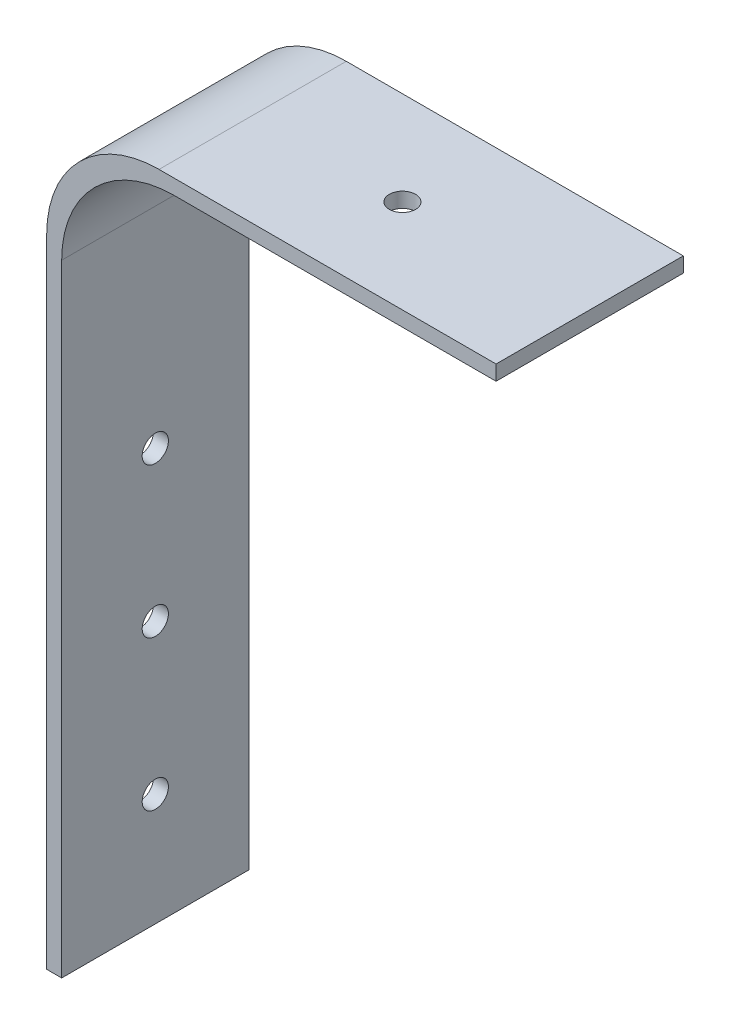
ISO-10303-21;
HEADER;
FILE_DESCRIPTION(('STEP AP214'),'2;1');
FILE_NAME('part.step','',(''),(''),'','','');
FILE_SCHEMA(('AUTOMOTIVE_DESIGN { 1 0 10303 214 1 1 1 1 }'));
ENDSEC;
DATA;
#1=APPLICATION_CONTEXT('core data for automotive mechanical design processes');
#2=APPLICATION_PROTOCOL_DEFINITION('international standard','automotive_design',2000,#1);
#3=PRODUCT_CONTEXT('',#1,'mechanical');
#4=PRODUCT('Part','Part','',(#3));
#5=PRODUCT_RELATED_PRODUCT_CATEGORY('part','',(#4));
#6=PRODUCT_DEFINITION_FORMATION('','',#4);
#7=PRODUCT_DEFINITION_CONTEXT('part definition',#1,'design');
#8=PRODUCT_DEFINITION('design','',#6,#7);
#9=PRODUCT_DEFINITION_SHAPE('','',#8);
#10=(LENGTH_UNIT() NAMED_UNIT(*) SI_UNIT(.MILLI.,.METRE.));
#11=(NAMED_UNIT(*) PLANE_ANGLE_UNIT() SI_UNIT($,.RADIAN.));
#12=(NAMED_UNIT(*) SI_UNIT($,.STERADIAN.) SOLID_ANGLE_UNIT());
#13=UNCERTAINTY_MEASURE_WITH_UNIT(LENGTH_MEASURE(1.E-05),#10,'distance_accuracy_value','');
#14=(GEOMETRIC_REPRESENTATION_CONTEXT(3) GLOBAL_UNCERTAINTY_ASSIGNED_CONTEXT((#13)) GLOBAL_UNIT_ASSIGNED_CONTEXT((#10,
#11,#12)) REPRESENTATION_CONTEXT('',''));
#15=CARTESIAN_POINT('',(0.,0.,0.));
#16=DIRECTION('',(0.,0.,1.));
#17=DIRECTION('',(1.,0.,0.));
#18=AXIS2_PLACEMENT_3D('',#15,#16,#17);
#19=CARTESIAN_POINT('',(30.,30.,25.));
#20=DIRECTION('',(-1.,0.,0.));
#21=DIRECTION('',(0.,-1.,0.));
#22=AXIS2_PLACEMENT_3D('',#19,#20,#21);
#23=PLANE('',#22);
#24=DIRECTION('',(0.,1.,0.));
#25=VECTOR('',#24,1.);
#26=CARTESIAN_POINT('',(30.,30.,0.));
#27=LINE('',#26,#25);
#28=CARTESIAN_POINT('',(30.,28.,0.));
#29=VERTEX_POINT('',#28);
#30=CARTESIAN_POINT('',(30.,30.,0.));
#31=VERTEX_POINT('',#30);
#32=EDGE_CURVE('E146',#29,#31,#27,.T.);
#33=ORIENTED_EDGE('',*,*,#32,.T.);
#34=DIRECTION('',(0.,0.,-1.));
#35=VECTOR('',#34,1.);
#36=CARTESIAN_POINT('',(30.,30.,25.));
#37=LINE('',#36,#35);
#38=CARTESIAN_POINT('',(30.,30.,25.));
#39=VERTEX_POINT('',#38);
#40=EDGE_CURVE('E11',#39,#31,#37,.T.);
#41=ORIENTED_EDGE('',*,*,#40,.F.);
#42=DIRECTION('',(0.,1.,0.));
#43=VECTOR('',#42,1.);
#44=CARTESIAN_POINT('',(30.,30.,25.));
#45=LINE('',#44,#43);
#46=CARTESIAN_POINT('',(30.,28.,25.));
#47=VERTEX_POINT('',#46);
#48=EDGE_CURVE('E169',#47,#39,#45,.T.);
#49=ORIENTED_EDGE('',*,*,#48,.F.);
#50=DIRECTION('',(0.,0.,-1.));
#51=VECTOR('',#50,1.);
#52=CARTESIAN_POINT('',(30.,28.,25.));
#53=LINE('',#52,#51);
#54=EDGE_CURVE('E142',#47,#29,#53,.T.);
#55=ORIENTED_EDGE('',*,*,#54,.T.);
#56=EDGE_LOOP('',(#33,#41,#49,#55));
#57=FACE_BOUND('',#56,.T.);
#58=ADVANCED_FACE('F45',(#57),#23,.F.);
#59=CARTESIAN_POINT('',(-15.,30.,25.));
#60=DIRECTION('',(0.,-1.,0.));
#61=DIRECTION('',(0.,0.,-1.));
#62=AXIS2_PLACEMENT_3D('',#59,#60,#61);
#63=PLANE('',#62);
#64=CARTESIAN_POINT('',(5.,30.,12.5));
#65=DIRECTION('',(0.,1.,0.));
#66=DIRECTION('',(0.,0.,1.));
#67=AXIS2_PLACEMENT_3D('',#64,#65,#66);
#68=CIRCLE('',#67,1.75);
#69=CARTESIAN_POINT('',(5.,30.,14.25));
#70=VERTEX_POINT('',#69);
#71=EDGE_CURVE('E237',#70,#70,#68,.T.);
#72=ORIENTED_EDGE('',*,*,#71,.F.);
#73=EDGE_LOOP('',(#72));
#74=FACE_BOUND('',#73,.T.);
#75=DIRECTION('',(-1.,0.,0.));
#76=VECTOR('',#75,1.);
#77=CARTESIAN_POINT('',(-15.,30.,0.));
#78=LINE('',#77,#76);
#79=CARTESIAN_POINT('',(-15.,30.,0.));
#80=VERTEX_POINT('',#79);
#81=EDGE_CURVE('E150',#31,#80,#78,.T.);
#82=ORIENTED_EDGE('',*,*,#81,.T.);
#83=DIRECTION('',(0.,0.,-1.));
#84=VECTOR('',#83,1.);
#85=CARTESIAN_POINT('',(-15.,30.,25.));
#86=LINE('',#85,#84);
#87=CARTESIAN_POINT('',(-15.,30.,25.));
#88=VERTEX_POINT('',#87);
#89=EDGE_CURVE('E54',#88,#80,#86,.T.);
#90=ORIENTED_EDGE('',*,*,#89,.F.);
#91=DIRECTION('',(-1.,0.,0.));
#92=VECTOR('',#91,1.);
#93=CARTESIAN_POINT('',(-15.,30.,25.));
#94=LINE('',#93,#92);
#95=EDGE_CURVE('E105',#39,#88,#94,.T.);
#96=ORIENTED_EDGE('',*,*,#95,.F.);
#97=ORIENTED_EDGE('',*,*,#40,.T.);
#98=EDGE_LOOP('',(#82,#90,#96,#97));
#99=FACE_BOUND('',#98,.T.);
#100=ADVANCED_FACE('F254',(#74,#99),#63,.F.);
#101=CARTESIAN_POINT('',(-15.,15.,25.));
#102=DIRECTION('',(0.,0.,-1.));
#103=DIRECTION('',(-1.,0.,0.));
#104=AXIS2_PLACEMENT_3D('',#101,#102,#103);
#105=CYLINDRICAL_SURFACE('',#104,15.);
#106=CARTESIAN_POINT('',(-15.,15.,0.));
#107=DIRECTION('',(0.,0.,1.));
#108=DIRECTION('',(1.,0.,0.));
#109=AXIS2_PLACEMENT_3D('',#106,#107,#108);
#110=CIRCLE('',#109,15.);
#111=CARTESIAN_POINT('',(-30.,15.,0.));
#112=VERTEX_POINT('',#111);
#113=EDGE_CURVE('E154',#80,#112,#110,.T.);
#114=ORIENTED_EDGE('',*,*,#113,.T.);
#115=DIRECTION('',(0.,0.,-1.));
#116=VECTOR('',#115,1.);
#117=CARTESIAN_POINT('',(-30.,15.,25.));
#118=LINE('',#117,#116);
#119=CARTESIAN_POINT('',(-30.,15.,25.));
#120=VERTEX_POINT('',#119);
#121=EDGE_CURVE('E180',#120,#112,#118,.T.);
#122=ORIENTED_EDGE('',*,*,#121,.F.);
#123=CARTESIAN_POINT('',(-15.,15.,25.));
#124=DIRECTION('',(0.,0.,1.));
#125=DIRECTION('',(1.,0.,0.));
#126=AXIS2_PLACEMENT_3D('',#123,#124,#125);
#127=CIRCLE('',#126,15.);
#128=EDGE_CURVE('E190',#88,#120,#127,.T.);
#129=ORIENTED_EDGE('',*,*,#128,.F.);
#130=ORIENTED_EDGE('',*,*,#89,.T.);
#131=EDGE_LOOP('',(#114,#122,#129,#130));
#132=FACE_BOUND('',#131,.T.);
#133=ADVANCED_FACE('F188',(#132),#105,.T.);
#134=CARTESIAN_POINT('',(-30.,15.,25.));
#135=DIRECTION('',(1.,0.,0.));
#136=DIRECTION('',(0.,1.,0.));
#137=AXIS2_PLACEMENT_3D('',#134,#135,#136);
#138=PLANE('',#137);
#139=CARTESIAN_POINT('',(-30.,-15.,12.5));
#140=DIRECTION('',(-1.,0.,0.));
#141=DIRECTION('',(0.,-1.,0.));
#142=AXIS2_PLACEMENT_3D('',#139,#140,#141);
#143=CIRCLE('',#142,1.75);
#144=CARTESIAN_POINT('',(-30.,-16.75,12.5));
#145=VERTEX_POINT('',#144);
#146=EDGE_CURVE('E230',#145,#145,#143,.T.);
#147=ORIENTED_EDGE('',*,*,#146,.F.);
#148=EDGE_LOOP('',(#147));
#149=FACE_BOUND('',#148,.T.);
#150=CARTESIAN_POINT('',(-30.,-35.,12.5000000000002));
#151=DIRECTION('',(-1.,0.,0.));
#152=DIRECTION('',(0.,-1.,0.));
#153=AXIS2_PLACEMENT_3D('',#150,#151,#152);
#154=CIRCLE('',#153,1.75);
#155=CARTESIAN_POINT('',(-30.,-36.75,12.5000000000002));
#156=VERTEX_POINT('',#155);
#157=EDGE_CURVE('E226',#156,#156,#154,.T.);
#158=ORIENTED_EDGE('',*,*,#157,.F.);
#159=EDGE_LOOP('',(#158));
#160=FACE_BOUND('',#159,.T.);
#161=CARTESIAN_POINT('',(-30.,-55.,12.5000000000004));
#162=DIRECTION('',(-1.,0.,0.));
#163=DIRECTION('',(0.,-1.,0.));
#164=AXIS2_PLACEMENT_3D('',#161,#162,#163);
#165=CIRCLE('',#164,1.75);
#166=CARTESIAN_POINT('',(-30.,-56.75,12.5000000000004));
#167=VERTEX_POINT('',#166);
#168=EDGE_CURVE('E217',#167,#167,#165,.T.);
#169=ORIENTED_EDGE('',*,*,#168,.F.);
#170=EDGE_LOOP('',(#169));
#171=FACE_BOUND('',#170,.T.);
#172=DIRECTION('',(0.,-1.,0.));
#173=VECTOR('',#172,1.);
#174=CARTESIAN_POINT('',(-30.,15.,0.));
#175=LINE('',#174,#173);
#176=CARTESIAN_POINT('',(-30.,-70.,0.));
#177=VERTEX_POINT('',#176);
#178=EDGE_CURVE('E157',#112,#177,#175,.T.);
#179=ORIENTED_EDGE('',*,*,#178,.T.);
#180=DIRECTION('',(0.,0.,-1.));
#181=VECTOR('',#180,1.);
#182=CARTESIAN_POINT('',(-30.,-70.,25.));
#183=LINE('',#182,#181);
#184=CARTESIAN_POINT('',(-30.,-70.,25.));
#185=VERTEX_POINT('',#184);
#186=EDGE_CURVE('E176',#185,#177,#183,.T.);
#187=ORIENTED_EDGE('',*,*,#186,.F.);
#188=DIRECTION('',(0.,-1.,0.));
#189=VECTOR('',#188,1.);
#190=CARTESIAN_POINT('',(-30.,15.,25.));
#191=LINE('',#190,#189);
#192=EDGE_CURVE('E203',#120,#185,#191,.T.);
#193=ORIENTED_EDGE('',*,*,#192,.F.);
#194=ORIENTED_EDGE('',*,*,#121,.T.);
#195=EDGE_LOOP('',(#179,#187,#193,#194));
#196=FACE_BOUND('',#195,.T.);
#197=ADVANCED_FACE('F198',(#149,#160,#171,#196),#138,.F.);
#198=CARTESIAN_POINT('',(-30.,-70.,25.));
#199=DIRECTION('',(0.,1.,0.));
#200=DIRECTION('',(0.,0.,1.));
#201=AXIS2_PLACEMENT_3D('',#198,#199,#200);
#202=PLANE('',#201);
#203=DIRECTION('',(1.,0.,0.));
#204=VECTOR('',#203,1.);
#205=CARTESIAN_POINT('',(-30.,-70.,0.));
#206=LINE('',#205,#204);
#207=CARTESIAN_POINT('',(-28.,-70.,0.));
#208=VERTEX_POINT('',#207);
#209=EDGE_CURVE('E160',#177,#208,#206,.T.);
#210=ORIENTED_EDGE('',*,*,#209,.T.);
#211=DIRECTION('',(0.,0.,-1.));
#212=VECTOR('',#211,1.);
#213=CARTESIAN_POINT('',(-28.,-70.,25.));
#214=LINE('',#213,#212);
#215=CARTESIAN_POINT('',(-28.,-70.,25.));
#216=VERTEX_POINT('',#215);
#217=EDGE_CURVE('E135',#216,#208,#214,.T.);
#218=ORIENTED_EDGE('',*,*,#217,.F.);
#219=DIRECTION('',(1.,0.,0.));
#220=VECTOR('',#219,1.);
#221=CARTESIAN_POINT('',(-30.,-70.,25.));
#222=LINE('',#221,#220);
#223=EDGE_CURVE('E124',#185,#216,#222,.T.);
#224=ORIENTED_EDGE('',*,*,#223,.F.);
#225=ORIENTED_EDGE('',*,*,#186,.T.);
#226=EDGE_LOOP('',(#210,#218,#224,#225));
#227=FACE_BOUND('',#226,.T.);
#228=ADVANCED_FACE('F201',(#227),#202,.F.);
#229=CARTESIAN_POINT('',(-28.,-70.,25.));
#230=DIRECTION('',(-1.,0.,0.));
#231=DIRECTION('',(0.,-1.,0.));
#232=AXIS2_PLACEMENT_3D('',#229,#230,#231);
#233=PLANE('',#232);
#234=CARTESIAN_POINT('',(-28.,-15.,12.5));
#235=DIRECTION('',(-1.,0.,0.));
#236=DIRECTION('',(0.,-1.,0.));
#237=AXIS2_PLACEMENT_3D('',#234,#235,#236);
#238=CIRCLE('',#237,1.75);
#239=CARTESIAN_POINT('',(-28.,-16.75,12.5));
#240=VERTEX_POINT('',#239);
#241=EDGE_CURVE('E151',#240,#240,#238,.T.);
#242=ORIENTED_EDGE('',*,*,#241,.T.);
#243=EDGE_LOOP('',(#242));
#244=FACE_BOUND('',#243,.T.);
#245=CARTESIAN_POINT('',(-28.,-35.,12.5000000000002));
#246=DIRECTION('',(-1.,0.,0.));
#247=DIRECTION('',(0.,-1.,0.));
#248=AXIS2_PLACEMENT_3D('',#245,#246,#247);
#249=CIRCLE('',#248,1.75);
#250=CARTESIAN_POINT('',(-28.,-36.75,12.5000000000002));
#251=VERTEX_POINT('',#250);
#252=EDGE_CURVE('E222',#251,#251,#249,.T.);
#253=ORIENTED_EDGE('',*,*,#252,.T.);
#254=EDGE_LOOP('',(#253));
#255=FACE_BOUND('',#254,.T.);
#256=CARTESIAN_POINT('',(-28.,-55.,12.5000000000004));
#257=DIRECTION('',(-1.,0.,0.));
#258=DIRECTION('',(0.,-1.,0.));
#259=AXIS2_PLACEMENT_3D('',#256,#257,#258);
#260=CIRCLE('',#259,1.75);
#261=CARTESIAN_POINT('',(-28.,-56.75,12.5000000000004));
#262=VERTEX_POINT('',#261);
#263=EDGE_CURVE('E213',#262,#262,#260,.T.);
#264=ORIENTED_EDGE('',*,*,#263,.T.);
#265=EDGE_LOOP('',(#264));
#266=FACE_BOUND('',#265,.T.);
#267=DIRECTION('',(0.,1.,0.));
#268=VECTOR('',#267,1.);
#269=CARTESIAN_POINT('',(-28.,-70.,0.));
#270=LINE('',#269,#268);
#271=CARTESIAN_POINT('',(-28.,13.,0.));
#272=VERTEX_POINT('',#271);
#273=EDGE_CURVE('E133',#208,#272,#270,.T.);
#274=ORIENTED_EDGE('',*,*,#273,.T.);
#275=DIRECTION('',(0.,0.,-1.));
#276=VECTOR('',#275,1.);
#277=CARTESIAN_POINT('',(-28.,13.,25.));
#278=LINE('',#277,#276);
#279=CARTESIAN_POINT('',(-28.,13.,25.));
#280=VERTEX_POINT('',#279);
#281=EDGE_CURVE('E130',#280,#272,#278,.T.);
#282=ORIENTED_EDGE('',*,*,#281,.F.);
#283=DIRECTION('',(0.,1.,0.));
#284=VECTOR('',#283,1.);
#285=CARTESIAN_POINT('',(-28.,-70.,25.));
#286=LINE('',#285,#284);
#287=EDGE_CURVE('E118',#216,#280,#286,.T.);
#288=ORIENTED_EDGE('',*,*,#287,.F.);
#289=ORIENTED_EDGE('',*,*,#217,.T.);
#290=EDGE_LOOP('',(#274,#282,#288,#289));
#291=FACE_BOUND('',#290,.T.);
#292=ADVANCED_FACE('F131',(#244,#255,#266,#291),#233,.F.);
#293=CARTESIAN_POINT('',(-13.,13.,25.));
#294=DIRECTION('',(0.,0.,-1.));
#295=DIRECTION('',(-1.,0.,0.));
#296=AXIS2_PLACEMENT_3D('',#293,#294,#295);
#297=CYLINDRICAL_SURFACE('',#296,15.);
#298=CARTESIAN_POINT('',(-13.,13.,0.));
#299=DIRECTION('',(0.,0.,-1.));
#300=DIRECTION('',(1.,0.,0.));
#301=AXIS2_PLACEMENT_3D('',#298,#299,#300);
#302=CIRCLE('',#301,15.);
#303=CARTESIAN_POINT('',(-13.,28.,0.));
#304=VERTEX_POINT('',#303);
#305=EDGE_CURVE('E91',#272,#304,#302,.T.);
#306=ORIENTED_EDGE('',*,*,#305,.T.);
#307=DIRECTION('',(0.,0.,-1.));
#308=VECTOR('',#307,1.);
#309=CARTESIAN_POINT('',(-13.,28.,25.));
#310=LINE('',#309,#308);
#311=CARTESIAN_POINT('',(-13.,28.,25.));
#312=VERTEX_POINT('',#311);
#313=EDGE_CURVE('E136',#312,#304,#310,.T.);
#314=ORIENTED_EDGE('',*,*,#313,.F.);
#315=CARTESIAN_POINT('',(-13.,13.,25.));
#316=DIRECTION('',(0.,0.,-1.));
#317=DIRECTION('',(1.,0.,0.));
#318=AXIS2_PLACEMENT_3D('',#315,#316,#317);
#319=CIRCLE('',#318,15.);
#320=EDGE_CURVE('E122',#280,#312,#319,.T.);
#321=ORIENTED_EDGE('',*,*,#320,.F.);
#322=ORIENTED_EDGE('',*,*,#281,.T.);
#323=EDGE_LOOP('',(#306,#314,#321,#322));
#324=FACE_BOUND('',#323,.T.);
#325=ADVANCED_FACE('F138',(#324),#297,.F.);
#326=CARTESIAN_POINT('',(30.,28.,25.));
#327=DIRECTION('',(0.,1.,0.));
#328=DIRECTION('',(-1.,0.,0.));
#329=AXIS2_PLACEMENT_3D('',#326,#327,#328);
#330=PLANE('',#329);
#331=CARTESIAN_POINT('',(5.,28.,12.5));
#332=DIRECTION('',(0.,1.,0.));
#333=DIRECTION('',(0.,0.,1.));
#334=AXIS2_PLACEMENT_3D('',#331,#332,#333);
#335=CIRCLE('',#334,1.75);
#336=CARTESIAN_POINT('',(5.,28.,14.25));
#337=VERTEX_POINT('',#336);
#338=EDGE_CURVE('E218',#337,#337,#335,.T.);
#339=ORIENTED_EDGE('',*,*,#338,.T.);
#340=EDGE_LOOP('',(#339));
#341=FACE_BOUND('',#340,.T.);
#342=DIRECTION('',(1.,0.,0.));
#343=VECTOR('',#342,1.);
#344=CARTESIAN_POINT('',(30.,28.,0.));
#345=LINE('',#344,#343);
#346=EDGE_CURVE('E97',#304,#29,#345,.T.);
#347=ORIENTED_EDGE('',*,*,#346,.T.);
#348=ORIENTED_EDGE('',*,*,#54,.F.);
#349=DIRECTION('',(1.,0.,0.));
#350=VECTOR('',#349,1.);
#351=CARTESIAN_POINT('',(30.,28.,25.));
#352=LINE('',#351,#350);
#353=EDGE_CURVE('E62',#312,#47,#352,.T.);
#354=ORIENTED_EDGE('',*,*,#353,.F.);
#355=ORIENTED_EDGE('',*,*,#313,.T.);
#356=EDGE_LOOP('',(#347,#348,#354,#355));
#357=FACE_BOUND('',#356,.T.);
#358=ADVANCED_FACE('F245',(#341,#357),#330,.F.);
#359=CARTESIAN_POINT('',(-13.,13.,25.));
#360=DIRECTION('',(0.,0.,1.));
#361=DIRECTION('',(1.,0.,0.));
#362=AXIS2_PLACEMENT_3D('',#359,#360,#361);
#363=PLANE('',#362);
#364=ORIENTED_EDGE('',*,*,#48,.T.);
#365=ORIENTED_EDGE('',*,*,#95,.T.);
#366=ORIENTED_EDGE('',*,*,#128,.T.);
#367=ORIENTED_EDGE('',*,*,#192,.T.);
#368=ORIENTED_EDGE('',*,*,#223,.T.);
#369=ORIENTED_EDGE('',*,*,#287,.T.);
#370=ORIENTED_EDGE('',*,*,#320,.T.);
#371=ORIENTED_EDGE('',*,*,#353,.T.);
#372=EDGE_LOOP('',(#364,#365,#366,#367,#368,#369,#370,#371));
#373=FACE_BOUND('',#372,.T.);
#374=ADVANCED_FACE('F120',(#373),#363,.T.);
#375=CARTESIAN_POINT('',(-13.,13.,0.));
#376=DIRECTION('',(0.,0.,1.));
#377=DIRECTION('',(1.,0.,0.));
#378=AXIS2_PLACEMENT_3D('',#375,#376,#377);
#379=PLANE('',#378);
#380=ORIENTED_EDGE('',*,*,#32,.F.);
#381=ORIENTED_EDGE('',*,*,#346,.F.);
#382=ORIENTED_EDGE('',*,*,#305,.F.);
#383=ORIENTED_EDGE('',*,*,#273,.F.);
#384=ORIENTED_EDGE('',*,*,#209,.F.);
#385=ORIENTED_EDGE('',*,*,#178,.F.);
#386=ORIENTED_EDGE('',*,*,#113,.F.);
#387=ORIENTED_EDGE('',*,*,#81,.F.);
#388=EDGE_LOOP('',(#380,#381,#382,#383,#384,#385,#386,#387));
#389=FACE_BOUND('',#388,.T.);
#390=ADVANCED_FACE('F194',(#389),#379,.F.);
#391=CARTESIAN_POINT('',(-28.,-55.,12.5000000000004));
#392=DIRECTION('',(-1.,0.,0.));
#393=DIRECTION('',(0.,-1.,0.));
#394=AXIS2_PLACEMENT_3D('',#391,#392,#393);
#395=CYLINDRICAL_SURFACE('',#394,1.75);
#396=ORIENTED_EDGE('',*,*,#263,.F.);
#397=EDGE_LOOP('',(#396));
#398=FACE_BOUND('',#397,.T.);
#399=ORIENTED_EDGE('',*,*,#168,.T.);
#400=EDGE_LOOP('',(#399));
#401=FACE_BOUND('',#400,.T.);
#402=ADVANCED_FACE('F332',(#398,#401),#395,.F.);
#403=CARTESIAN_POINT('',(-28.,-35.,12.5000000000002));
#404=DIRECTION('',(-1.,0.,0.));
#405=DIRECTION('',(0.,-1.,0.));
#406=AXIS2_PLACEMENT_3D('',#403,#404,#405);
#407=CYLINDRICAL_SURFACE('',#406,1.75);
#408=ORIENTED_EDGE('',*,*,#252,.F.);
#409=EDGE_LOOP('',(#408));
#410=FACE_BOUND('',#409,.T.);
#411=ORIENTED_EDGE('',*,*,#157,.T.);
#412=EDGE_LOOP('',(#411));
#413=FACE_BOUND('',#412,.T.);
#414=ADVANCED_FACE('F337',(#410,#413),#407,.F.);
#415=CARTESIAN_POINT('',(-28.,-15.,12.5));
#416=DIRECTION('',(-1.,0.,0.));
#417=DIRECTION('',(0.,-1.,0.));
#418=AXIS2_PLACEMENT_3D('',#415,#416,#417);
#419=CYLINDRICAL_SURFACE('',#418,1.75);
#420=ORIENTED_EDGE('',*,*,#241,.F.);
#421=EDGE_LOOP('',(#420));
#422=FACE_BOUND('',#421,.T.);
#423=ORIENTED_EDGE('',*,*,#146,.T.);
#424=EDGE_LOOP('',(#423));
#425=FACE_BOUND('',#424,.T.);
#426=ADVANCED_FACE('F250',(#422,#425),#419,.F.);
#427=CARTESIAN_POINT('',(5.,28.,12.5));
#428=DIRECTION('',(0.,1.,0.));
#429=DIRECTION('',(0.,0.,1.));
#430=AXIS2_PLACEMENT_3D('',#427,#428,#429);
#431=CYLINDRICAL_SURFACE('',#430,1.75);
#432=ORIENTED_EDGE('',*,*,#338,.F.);
#433=EDGE_LOOP('',(#432));
#434=FACE_BOUND('',#433,.T.);
#435=ORIENTED_EDGE('',*,*,#71,.T.);
#436=EDGE_LOOP('',(#435));
#437=FACE_BOUND('',#436,.T.);
#438=ADVANCED_FACE('F247',(#434,#437),#431,.F.);
#439=CLOSED_SHELL('',(#58,#100,#133,#197,#228,#292,#325,#358,#374,#390,#402,#414,#426,#438));
#440=MANIFOLD_SOLID_BREP('B2',#439);
#441=ADVANCED_BREP_SHAPE_REPRESENTATION('',(#18,#440),#14);
#442=SHAPE_DEFINITION_REPRESENTATION(#9,#441);
ENDSEC;
END-ISO-10303-21;
